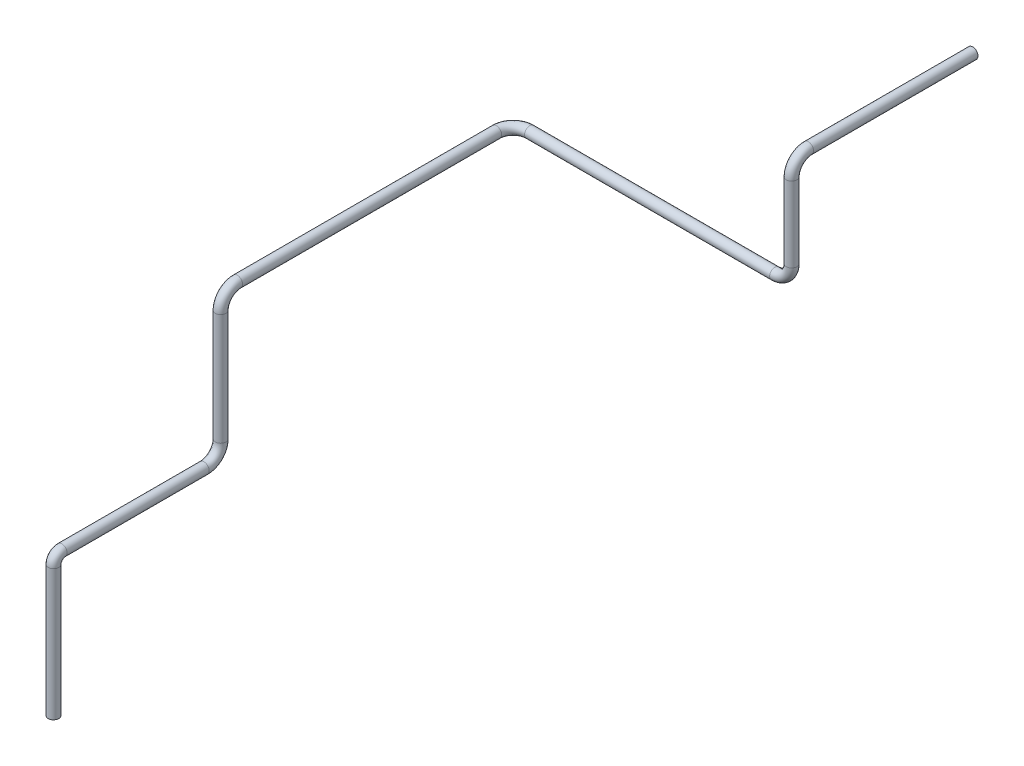
ISO-10303-21;
HEADER;
FILE_DESCRIPTION(('STEP AP214'),'2;1');
FILE_NAME('part.step','',(''),(''),'','','');
FILE_SCHEMA(('AUTOMOTIVE_DESIGN { 1 0 10303 214 1 1 1 1 }'));
ENDSEC;
DATA;
#1=APPLICATION_CONTEXT('core data for automotive mechanical design processes');
#2=APPLICATION_PROTOCOL_DEFINITION('international standard','automotive_design',2000,#1);
#3=PRODUCT_CONTEXT('',#1,'mechanical');
#4=PRODUCT('Part','Part','',(#3));
#5=PRODUCT_RELATED_PRODUCT_CATEGORY('part','',(#4));
#6=PRODUCT_DEFINITION_FORMATION('','',#4);
#7=PRODUCT_DEFINITION_CONTEXT('part definition',#1,'design');
#8=PRODUCT_DEFINITION('design','',#6,#7);
#9=PRODUCT_DEFINITION_SHAPE('','',#8);
#10=(LENGTH_UNIT() NAMED_UNIT(*) SI_UNIT(.MILLI.,.METRE.));
#11=(NAMED_UNIT(*) PLANE_ANGLE_UNIT() SI_UNIT($,.RADIAN.));
#12=(NAMED_UNIT(*) SI_UNIT($,.STERADIAN.) SOLID_ANGLE_UNIT());
#13=UNCERTAINTY_MEASURE_WITH_UNIT(LENGTH_MEASURE(1.E-05),#10,'distance_accuracy_value','');
#14=(GEOMETRIC_REPRESENTATION_CONTEXT(3) GLOBAL_UNCERTAINTY_ASSIGNED_CONTEXT((#13)) GLOBAL_UNIT_ASSIGNED_CONTEXT((#10,
#11,#12)) REPRESENTATION_CONTEXT('',''));
#15=CARTESIAN_POINT('',(0.,0.,0.));
#16=DIRECTION('',(0.,0.,1.));
#17=DIRECTION('',(1.,0.,0.));
#18=AXIS2_PLACEMENT_3D('',#15,#16,#17);
#19=CARTESIAN_POINT('',(0.,0.,100.));
#20=DIRECTION('',(0.,0.,-1.));
#21=DIRECTION('',(-1.,0.,0.));
#22=AXIS2_PLACEMENT_3D('',#19,#20,#21);
#23=CYLINDRICAL_SURFACE('',#22,19.05);
#24=CARTESIAN_POINT('',(0.,0.,0.));
#25=DIRECTION('',(0.,0.,1.));
#26=DIRECTION('',(1.,0.,0.));
#27=AXIS2_PLACEMENT_3D('',#24,#25,#26);
#28=CIRCLE('',#27,19.05);
#29=CARTESIAN_POINT('',(19.05,0.,0.));
#30=VERTEX_POINT('',#29);
#31=EDGE_CURVE('E11',#30,#30,#28,.T.);
#32=ORIENTED_EDGE('',*,*,#31,.T.);
#33=EDGE_LOOP('',(#32));
#34=FACE_BOUND('',#33,.T.);
#35=CARTESIAN_POINT('',(0.,0.,590.));
#36=DIRECTION('',(0.,0.,1.));
#37=DIRECTION('',(1.,0.,0.));
#38=AXIS2_PLACEMENT_3D('',#35,#36,#37);
#39=CIRCLE('',#38,19.05);
#40=CARTESIAN_POINT('',(0.,19.05,590.));
#41=VERTEX_POINT('',#40);
#42=EDGE_CURVE('E81',#41,#41,#39,.T.);
#43=ORIENTED_EDGE('',*,*,#42,.F.);
#44=EDGE_LOOP('',(#43));
#45=FACE_BOUND('',#44,.T.);
#46=ADVANCED_FACE('F35',(#34,#45),#23,.T.);
#47=CARTESIAN_POINT('',(0.,0.,0.));
#48=DIRECTION('',(0.,0.,1.));
#49=DIRECTION('',(1.,0.,0.));
#50=AXIS2_PLACEMENT_3D('',#47,#48,#49);
#51=PLANE('',#50);
#52=ORIENTED_EDGE('',*,*,#31,.F.);
#53=EDGE_LOOP('',(#52));
#54=FACE_BOUND('',#53,.T.);
#55=ADVANCED_FACE('F88',(#54),#51,.F.);
#56=CARTESIAN_POINT('',(-1000.,-1410.,2300.));
#57=DIRECTION('',(0.,-1.,0.));
#58=DIRECTION('',(0.,0.,-1.));
#59=AXIS2_PLACEMENT_3D('',#56,#57,#58);
#60=PLANE('',#59);
#61=CARTESIAN_POINT('',(-1000.,-1410.,2300.));
#62=DIRECTION('',(0.,-1.,0.));
#63=DIRECTION('',(0.,0.,-1.));
#64=AXIS2_PLACEMENT_3D('',#61,#62,#63);
#65=CIRCLE('',#64,19.05);
#66=CARTESIAN_POINT('',(-1000.,-1410.,2280.95));
#67=VERTEX_POINT('',#66);
#68=EDGE_CURVE('E41',#67,#67,#65,.T.);
#69=ORIENTED_EDGE('',*,*,#68,.T.);
#70=EDGE_LOOP('',(#69));
#71=FACE_BOUND('',#70,.T.);
#72=ADVANCED_FACE('F45',(#71),#60,.T.);
#73=CARTESIAN_POINT('',(0.,-60.,590.));
#74=DIRECTION('',(1.,0.,0.));
#75=DIRECTION('',(0.,0.,-1.));
#76=AXIS2_PLACEMENT_3D('',#73,#74,#75);
#77=TOROIDAL_SURFACE('',#76,60.,19.05);
#78=CARTESIAN_POINT('',(0.,-60.,650.));
#79=DIRECTION('',(0.,-1.,0.));
#80=DIRECTION('',(1.,0.,0.));
#81=AXIS2_PLACEMENT_3D('',#78,#79,#80);
#82=CIRCLE('',#81,19.05);
#83=CARTESIAN_POINT('',(0.,-60.,669.05));
#84=VERTEX_POINT('',#83);
#85=EDGE_CURVE('E78',#84,#84,#82,.T.);
#86=CARTESIAN_POINT('',(0.,-60.,590.));
#87=DIRECTION('',(1.,0.,0.));
#88=DIRECTION('',(0.,0.,-1.));
#89=AXIS2_PLACEMENT_3D('',#86,#87,#88);
#90=CIRCLE('',#89,79.05);
#91=EDGE_CURVE('',#41,#84,#90,.T.);
#92=ORIENTED_EDGE('',*,*,#42,.T.);
#93=ORIENTED_EDGE('',*,*,#85,.F.);
#94=ORIENTED_EDGE('',*,*,#91,.T.);
#95=ORIENTED_EDGE('',*,*,#91,.F.);
#96=EDGE_LOOP('',(#92,#94,#93,#95));
#97=FACE_BOUND('',#96,.T.);
#98=ADVANCED_FACE('F85',(#97),#77,.T.);
#99=CARTESIAN_POINT('',(0.,-60.,650.));
#100=DIRECTION('',(0.,-1.,0.));
#101=DIRECTION('',(0.,0.,-1.));
#102=AXIS2_PLACEMENT_3D('',#99,#100,#101);
#103=CYLINDRICAL_SURFACE('',#102,19.05);
#104=CARTESIAN_POINT('',(0.,-330.,650.));
#105=DIRECTION('',(0.,-1.,0.));
#106=DIRECTION('',(1.,0.,0.));
#107=AXIS2_PLACEMENT_3D('',#104,#105,#106);
#108=CIRCLE('',#107,19.05);
#109=CARTESIAN_POINT('',(19.05,-330.,650.));
#110=VERTEX_POINT('',#109);
#111=EDGE_CURVE('E75',#110,#110,#108,.T.);
#112=ORIENTED_EDGE('',*,*,#111,.F.);
#113=EDGE_LOOP('',(#112));
#114=FACE_BOUND('',#113,.T.);
#115=ORIENTED_EDGE('',*,*,#85,.T.);
#116=EDGE_LOOP('',(#115));
#117=FACE_BOUND('',#116,.T.);
#118=ADVANCED_FACE('F141',(#114,#117),#103,.T.);
#119=CARTESIAN_POINT('',(-60.,-330.,650.));
#120=DIRECTION('',(0.,0.,-1.));
#121=DIRECTION('',(-1.,0.,0.));
#122=AXIS2_PLACEMENT_3D('',#119,#120,#121);
#123=TOROIDAL_SURFACE('',#122,60.,19.05);
#124=CARTESIAN_POINT('',(-60.,-390.,650.));
#125=DIRECTION('',(-1.,0.,0.));
#126=DIRECTION('',(0.,-1.,0.));
#127=AXIS2_PLACEMENT_3D('',#124,#125,#126);
#128=CIRCLE('',#127,19.05);
#129=CARTESIAN_POINT('',(-60.,-409.05,650.));
#130=VERTEX_POINT('',#129);
#131=EDGE_CURVE('E72',#130,#130,#128,.T.);
#132=CARTESIAN_POINT('',(-60.,-330.,650.));
#133=DIRECTION('',(0.,0.,-1.));
#134=DIRECTION('',(-1.,0.,0.));
#135=AXIS2_PLACEMENT_3D('',#132,#133,#134);
#136=CIRCLE('',#135,79.05);
#137=EDGE_CURVE('',#110,#130,#136,.T.);
#138=ORIENTED_EDGE('',*,*,#111,.T.);
#139=ORIENTED_EDGE('',*,*,#131,.F.);
#140=ORIENTED_EDGE('',*,*,#137,.T.);
#141=ORIENTED_EDGE('',*,*,#137,.F.);
#142=EDGE_LOOP('',(#138,#140,#139,#141));
#143=FACE_BOUND('',#142,.T.);
#144=ADVANCED_FACE('F137',(#143),#123,.T.);
#145=CARTESIAN_POINT('',(-60.,-390.,650.));
#146=DIRECTION('',(-1.,0.,0.));
#147=DIRECTION('',(0.,0.,1.));
#148=AXIS2_PLACEMENT_3D('',#145,#146,#147);
#149=CYLINDRICAL_SURFACE('',#148,19.05);
#150=CARTESIAN_POINT('',(-940.,-390.,650.));
#151=DIRECTION('',(-1.,0.,0.));
#152=DIRECTION('',(0.,-1.,0.));
#153=AXIS2_PLACEMENT_3D('',#150,#151,#152);
#154=CIRCLE('',#153,19.05);
#155=CARTESIAN_POINT('',(-940.,-390.,630.95));
#156=VERTEX_POINT('',#155);
#157=EDGE_CURVE('E69',#156,#156,#154,.T.);
#158=ORIENTED_EDGE('',*,*,#157,.F.);
#159=EDGE_LOOP('',(#158));
#160=FACE_BOUND('',#159,.T.);
#161=ORIENTED_EDGE('',*,*,#131,.T.);
#162=EDGE_LOOP('',(#161));
#163=FACE_BOUND('',#162,.T.);
#164=ADVANCED_FACE('F133',(#160,#163),#149,.T.);
#165=CARTESIAN_POINT('',(-940.,-390.,710.));
#166=DIRECTION('',(0.,1.,0.));
#167=DIRECTION('',(0.,0.,1.));
#168=AXIS2_PLACEMENT_3D('',#165,#166,#167);
#169=TOROIDAL_SURFACE('',#168,60.0000000000001,19.05);
#170=CARTESIAN_POINT('',(-1000.,-390.,710.));
#171=DIRECTION('',(0.,0.,1.));
#172=DIRECTION('',(0.,-1.,0.));
#173=AXIS2_PLACEMENT_3D('',#170,#171,#172);
#174=CIRCLE('',#173,19.05);
#175=CARTESIAN_POINT('',(-1019.05,-390.,710.));
#176=VERTEX_POINT('',#175);
#177=EDGE_CURVE('E66',#176,#176,#174,.T.);
#178=CARTESIAN_POINT('',(-940.,-390.,710.));
#179=DIRECTION('',(0.,1.,0.));
#180=DIRECTION('',(0.,0.,1.));
#181=AXIS2_PLACEMENT_3D('',#178,#179,#180);
#182=CIRCLE('',#181,79.0500000000001);
#183=EDGE_CURVE('',#156,#176,#182,.T.);
#184=ORIENTED_EDGE('',*,*,#157,.T.);
#185=ORIENTED_EDGE('',*,*,#177,.F.);
#186=ORIENTED_EDGE('',*,*,#183,.T.);
#187=ORIENTED_EDGE('',*,*,#183,.F.);
#188=EDGE_LOOP('',(#184,#186,#185,#187));
#189=FACE_BOUND('',#188,.T.);
#190=ADVANCED_FACE('F129',(#189),#169,.T.);
#191=CARTESIAN_POINT('',(-1000.,-390.,710.));
#192=DIRECTION('',(0.,0.,1.));
#193=DIRECTION('',(1.,0.,0.));
#194=AXIS2_PLACEMENT_3D('',#191,#192,#193);
#195=CYLINDRICAL_SURFACE('',#194,19.05);
#196=CARTESIAN_POINT('',(-1000.,-390.,1640.));
#197=DIRECTION('',(0.,0.,1.));
#198=DIRECTION('',(0.,-1.,0.));
#199=AXIS2_PLACEMENT_3D('',#196,#197,#198);
#200=CIRCLE('',#199,19.05);
#201=CARTESIAN_POINT('',(-1000.,-370.95,1640.));
#202=VERTEX_POINT('',#201);
#203=EDGE_CURVE('E63',#202,#202,#200,.T.);
#204=ORIENTED_EDGE('',*,*,#203,.F.);
#205=EDGE_LOOP('',(#204));
#206=FACE_BOUND('',#205,.T.);
#207=ORIENTED_EDGE('',*,*,#177,.T.);
#208=EDGE_LOOP('',(#207));
#209=FACE_BOUND('',#208,.T.);
#210=ADVANCED_FACE('F125',(#206,#209),#195,.T.);
#211=CARTESIAN_POINT('',(-1000.,-450.,1640.));
#212=DIRECTION('',(1.,0.,0.));
#213=DIRECTION('',(0.,0.,-1.));
#214=AXIS2_PLACEMENT_3D('',#211,#212,#213);
#215=TOROIDAL_SURFACE('',#214,60.,19.05);
#216=CARTESIAN_POINT('',(-1000.,-450.,1700.));
#217=DIRECTION('',(0.,-1.,0.));
#218=DIRECTION('',(0.,0.,-1.));
#219=AXIS2_PLACEMENT_3D('',#216,#217,#218);
#220=CIRCLE('',#219,19.05);
#221=CARTESIAN_POINT('',(-1000.,-450.,1719.05));
#222=VERTEX_POINT('',#221);
#223=EDGE_CURVE('E60',#222,#222,#220,.T.);
#224=CARTESIAN_POINT('',(-1000.,-450.,1640.));
#225=DIRECTION('',(1.,0.,0.));
#226=DIRECTION('',(0.,0.,-1.));
#227=AXIS2_PLACEMENT_3D('',#224,#225,#226);
#228=CIRCLE('',#227,79.05);
#229=EDGE_CURVE('',#202,#222,#228,.T.);
#230=ORIENTED_EDGE('',*,*,#203,.T.);
#231=ORIENTED_EDGE('',*,*,#223,.F.);
#232=ORIENTED_EDGE('',*,*,#229,.T.);
#233=ORIENTED_EDGE('',*,*,#229,.F.);
#234=EDGE_LOOP('',(#230,#232,#231,#233));
#235=FACE_BOUND('',#234,.T.);
#236=ADVANCED_FACE('F121',(#235),#215,.T.);
#237=CARTESIAN_POINT('',(-1000.,-450.,1700.));
#238=DIRECTION('',(0.,-1.,0.));
#239=DIRECTION('',(0.,0.,-1.));
#240=AXIS2_PLACEMENT_3D('',#237,#238,#239);
#241=CYLINDRICAL_SURFACE('',#240,19.05);
#242=CARTESIAN_POINT('',(-1000.,-850.,1700.));
#243=DIRECTION('',(0.,-1.,0.));
#244=DIRECTION('',(0.,0.,-1.));
#245=AXIS2_PLACEMENT_3D('',#242,#243,#244);
#246=CIRCLE('',#245,19.05);
#247=CARTESIAN_POINT('',(-1000.,-850.,1680.95));
#248=VERTEX_POINT('',#247);
#249=EDGE_CURVE('E57',#248,#248,#246,.T.);
#250=ORIENTED_EDGE('',*,*,#249,.F.);
#251=EDGE_LOOP('',(#250));
#252=FACE_BOUND('',#251,.T.);
#253=ORIENTED_EDGE('',*,*,#223,.T.);
#254=EDGE_LOOP('',(#253));
#255=FACE_BOUND('',#254,.T.);
#256=ADVANCED_FACE('F117',(#252,#255),#241,.T.);
#257=CARTESIAN_POINT('',(-1000.,-850.,1760.));
#258=DIRECTION('',(-1.,0.,0.));
#259=DIRECTION('',(0.,0.,1.));
#260=AXIS2_PLACEMENT_3D('',#257,#258,#259);
#261=TOROIDAL_SURFACE('',#260,60.0000000000001,19.05);
#262=CARTESIAN_POINT('',(-1000.,-910.,1760.));
#263=DIRECTION('',(0.,0.,1.));
#264=DIRECTION('',(0.,-1.,0.));
#265=AXIS2_PLACEMENT_3D('',#262,#263,#264);
#266=CIRCLE('',#265,19.05);
#267=CARTESIAN_POINT('',(-1000.,-929.05,1760.));
#268=VERTEX_POINT('',#267);
#269=EDGE_CURVE('E54',#268,#268,#266,.T.);
#270=CARTESIAN_POINT('',(-1000.,-850.,1760.));
#271=DIRECTION('',(-1.,0.,0.));
#272=DIRECTION('',(0.,0.,1.));
#273=AXIS2_PLACEMENT_3D('',#270,#271,#272);
#274=CIRCLE('',#273,79.0500000000001);
#275=EDGE_CURVE('',#248,#268,#274,.T.);
#276=ORIENTED_EDGE('',*,*,#249,.T.);
#277=ORIENTED_EDGE('',*,*,#269,.F.);
#278=ORIENTED_EDGE('',*,*,#275,.T.);
#279=ORIENTED_EDGE('',*,*,#275,.F.);
#280=EDGE_LOOP('',(#276,#278,#277,#279));
#281=FACE_BOUND('',#280,.T.);
#282=ADVANCED_FACE('F113',(#281),#261,.T.);
#283=CARTESIAN_POINT('',(-1000.,-910.,1760.));
#284=DIRECTION('',(0.,0.,1.));
#285=DIRECTION('',(1.,0.,0.));
#286=AXIS2_PLACEMENT_3D('',#283,#284,#285);
#287=CYLINDRICAL_SURFACE('',#286,19.05);
#288=CARTESIAN_POINT('',(-1000.,-910.,2270.));
#289=DIRECTION('',(0.,0.,1.));
#290=DIRECTION('',(0.,-1.,0.));
#291=AXIS2_PLACEMENT_3D('',#288,#289,#290);
#292=CIRCLE('',#291,19.05);
#293=CARTESIAN_POINT('',(-1000.,-890.95,2270.));
#294=VERTEX_POINT('',#293);
#295=EDGE_CURVE('E49',#294,#294,#292,.T.);
#296=ORIENTED_EDGE('',*,*,#295,.F.);
#297=EDGE_LOOP('',(#296));
#298=FACE_BOUND('',#297,.T.);
#299=ORIENTED_EDGE('',*,*,#269,.T.);
#300=EDGE_LOOP('',(#299));
#301=FACE_BOUND('',#300,.T.);
#302=ADVANCED_FACE('F106',(#298,#301),#287,.T.);
#303=CARTESIAN_POINT('',(-1000.,-940.,2270.));
#304=DIRECTION('',(1.,0.,0.));
#305=DIRECTION('',(0.,0.,-1.));
#306=AXIS2_PLACEMENT_3D('',#303,#304,#305);
#307=TOROIDAL_SURFACE('',#306,29.9999999999999,19.05);
#308=CARTESIAN_POINT('',(-1000.,-940.,2300.));
#309=DIRECTION('',(0.,-1.,0.));
#310=DIRECTION('',(0.,0.,-1.));
#311=AXIS2_PLACEMENT_3D('',#308,#309,#310);
#312=CIRCLE('',#311,19.05);
#313=CARTESIAN_POINT('',(-1000.,-940.,2319.05));
#314=VERTEX_POINT('',#313);
#315=EDGE_CURVE('E47',#314,#314,#312,.T.);
#316=CARTESIAN_POINT('',(-1000.,-940.,2270.));
#317=DIRECTION('',(1.,0.,0.));
#318=DIRECTION('',(0.,0.,-1.));
#319=AXIS2_PLACEMENT_3D('',#316,#317,#318);
#320=CIRCLE('',#319,49.0499999999999);
#321=EDGE_CURVE('',#294,#314,#320,.T.);
#322=ORIENTED_EDGE('',*,*,#295,.T.);
#323=ORIENTED_EDGE('',*,*,#315,.F.);
#324=ORIENTED_EDGE('',*,*,#321,.T.);
#325=ORIENTED_EDGE('',*,*,#321,.F.);
#326=EDGE_LOOP('',(#322,#324,#323,#325));
#327=FACE_BOUND('',#326,.T.);
#328=ADVANCED_FACE('F101',(#327),#307,.T.);
#329=CARTESIAN_POINT('',(-1000.,-940.,2300.));
#330=DIRECTION('',(0.,-1.,0.));
#331=DIRECTION('',(0.,0.,-1.));
#332=AXIS2_PLACEMENT_3D('',#329,#330,#331);
#333=CYLINDRICAL_SURFACE('',#332,19.05);
#334=ORIENTED_EDGE('',*,*,#68,.F.);
#335=EDGE_LOOP('',(#334));
#336=FACE_BOUND('',#335,.T.);
#337=ORIENTED_EDGE('',*,*,#315,.T.);
#338=EDGE_LOOP('',(#337));
#339=FACE_BOUND('',#338,.T.);
#340=ADVANCED_FACE('F94',(#336,#339),#333,.T.);
#341=CLOSED_SHELL('',(#46,#55,#72,#98,#118,#144,#164,#190,#210,#236,#256,#282,#302,#328,#340));
#342=MANIFOLD_SOLID_BREP('B2',#341);
#343=ADVANCED_BREP_SHAPE_REPRESENTATION('',(#18,#342),#14);
#344=SHAPE_DEFINITION_REPRESENTATION(#9,#343);
ENDSEC;
END-ISO-10303-21;
